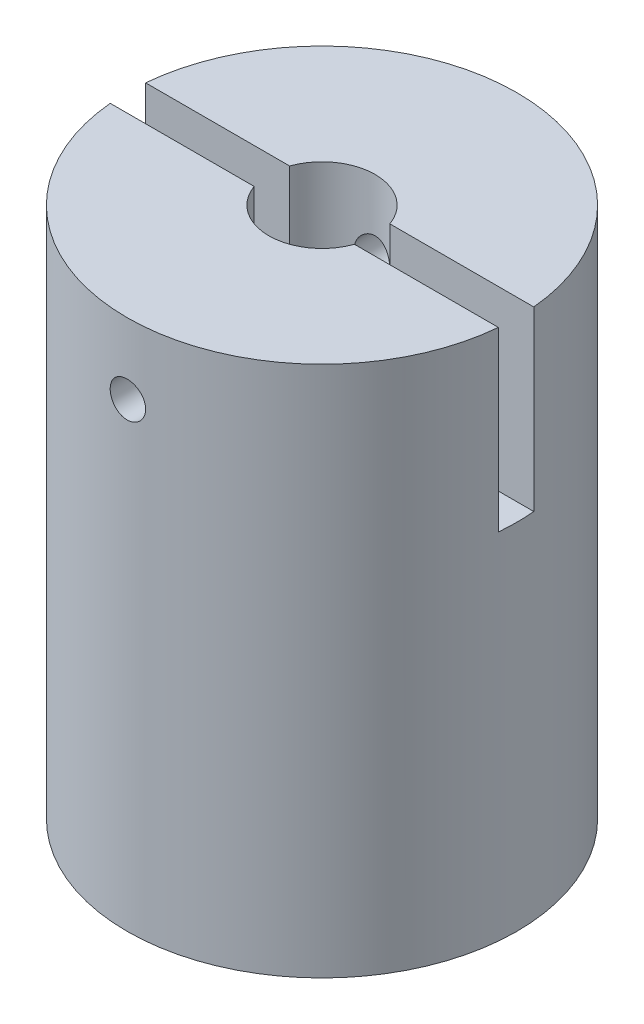
ISO-10303-21;
HEADER;
FILE_DESCRIPTION(('STEP AP214'),'2;1');
FILE_NAME('part.step','',(''),(''),'','','');
FILE_SCHEMA(('AUTOMOTIVE_DESIGN { 1 0 10303 214 1 1 1 1 }'));
ENDSEC;
DATA;
#1=APPLICATION_CONTEXT('core data for automotive mechanical design processes');
#2=APPLICATION_PROTOCOL_DEFINITION('international standard','automotive_design',2000,#1);
#3=PRODUCT_CONTEXT('',#1,'mechanical');
#4=PRODUCT('Part','Part','',(#3));
#5=PRODUCT_RELATED_PRODUCT_CATEGORY('part','',(#4));
#6=PRODUCT_DEFINITION_FORMATION('','',#4);
#7=PRODUCT_DEFINITION_CONTEXT('part definition',#1,'design');
#8=PRODUCT_DEFINITION('design','',#6,#7);
#9=PRODUCT_DEFINITION_SHAPE('','',#8);
#10=(LENGTH_UNIT() NAMED_UNIT(*) SI_UNIT(.MILLI.,.METRE.));
#11=(NAMED_UNIT(*) PLANE_ANGLE_UNIT() SI_UNIT($,.RADIAN.));
#12=(NAMED_UNIT(*) SI_UNIT($,.STERADIAN.) SOLID_ANGLE_UNIT());
#13=UNCERTAINTY_MEASURE_WITH_UNIT(LENGTH_MEASURE(1.E-05),#10,'distance_accuracy_value','');
#14=(GEOMETRIC_REPRESENTATION_CONTEXT(3) GLOBAL_UNCERTAINTY_ASSIGNED_CONTEXT((#13)) GLOBAL_UNIT_ASSIGNED_CONTEXT((#10,
#11,#12)) REPRESENTATION_CONTEXT('',''));
#15=CARTESIAN_POINT('',(0.,0.,0.));
#16=DIRECTION('',(0.,0.,1.));
#17=DIRECTION('',(1.,0.,0.));
#18=AXIS2_PLACEMENT_3D('',#15,#16,#17);
#19=CARTESIAN_POINT('',(0.,30.,0.));
#20=DIRECTION('',(0.,1.,0.));
#21=DIRECTION('',(0.,0.,1.));
#22=AXIS2_PLACEMENT_3D('',#19,#20,#21);
#23=PLANE('',#22);
#24=DIRECTION('',(1.,0.,0.));
#25=VECTOR('',#24,1.);
#26=CARTESIAN_POINT('',(-15.,30.,1.));
#27=LINE('',#26,#25);
#28=CARTESIAN_POINT('',(-10.9544511501033,30.,1.));
#29=VERTEX_POINT('',#28);
#30=CARTESIAN_POINT('',(-2.82842712474619,30.,1.));
#31=VERTEX_POINT('',#30);
#32=EDGE_CURVE('E190',#29,#31,#27,.T.);
#33=ORIENTED_EDGE('',*,*,#32,.F.);
#34=CARTESIAN_POINT('',(0.,30.,0.));
#35=DIRECTION('',(0.,1.,0.));
#36=DIRECTION('',(0.,0.,1.));
#37=AXIS2_PLACEMENT_3D('',#34,#35,#36);
#38=CIRCLE('',#37,11.);
#39=CARTESIAN_POINT('',(10.9544511501033,30.,1.));
#40=VERTEX_POINT('',#39);
#41=EDGE_CURVE('E130',#29,#40,#38,.T.);
#42=ORIENTED_EDGE('',*,*,#41,.T.);
#43=CARTESIAN_POINT('',(2.82842712474619,30.,1.));
#44=VERTEX_POINT('',#43);
#45=EDGE_CURVE('E123',#44,#40,#27,.T.);
#46=ORIENTED_EDGE('',*,*,#45,.F.);
#47=CARTESIAN_POINT('',(0.,30.,0.));
#48=DIRECTION('',(0.,1.,0.));
#49=DIRECTION('',(0.,0.,1.));
#50=AXIS2_PLACEMENT_3D('',#47,#48,#49);
#51=CIRCLE('',#50,3.);
#52=EDGE_CURVE('E139',#31,#44,#51,.T.);
#53=ORIENTED_EDGE('',*,*,#52,.F.);
#54=EDGE_LOOP('',(#33,#42,#46,#53));
#55=FACE_BOUND('',#54,.T.);
#56=ADVANCED_FACE('F33',(#55),#23,.T.);
#57=CARTESIAN_POINT('',(0.,30.,0.));
#58=DIRECTION('',(0.,-1.,0.));
#59=DIRECTION('',(0.,0.,-1.));
#60=AXIS2_PLACEMENT_3D('',#57,#58,#59);
#61=CYLINDRICAL_SURFACE('',#60,11.);
#62=CARTESIAN_POINT('',(0.,27.,-11.));
#63=CARTESIAN_POINT('',(-0.0560463184098415,26.9999975607395,-10.9999994084562));
#64=CARTESIAN_POINT('',(-0.112130316304954,26.9952723598371,-10.9995670959793));
#65=CARTESIAN_POINT('',(-0.222745225910004,26.9764929361657,-10.9978840834393));
#66=CARTESIAN_POINT('',(-0.277274327670013,26.9624282700333,-10.9966324672553));
#67=CARTESIAN_POINT('',(-0.38316148573152,26.9253811851023,-10.9934522196378));
#68=CARTESIAN_POINT('',(-0.434521368502916,26.9024039594512,-10.9915239825183));
#69=CARTESIAN_POINT('',(-0.53264359406505,26.8481936342475,-10.987206461568));
#70=CARTESIAN_POINT('',(-0.579406887560637,26.8169622468395,-10.9848172733792));
#71=CARTESIAN_POINT('',(-0.667160744591637,26.7470291725081,-10.9798377243701));
#72=CARTESIAN_POINT('',(-0.708135584180957,26.7083077899558,-10.9772468441588));
#73=CARTESIAN_POINT('',(-0.783014385273113,26.6245356999598,-10.97216024971));
#74=CARTESIAN_POINT('',(-0.816918029190443,26.5794847083891,-10.969664539751));
#75=CARTESIAN_POINT('',(-0.876746442765576,26.4842354923924,-10.9650454120851));
#76=CARTESIAN_POINT('',(-0.902657198623715,26.434028430975,-10.9629226510361));
#77=CARTESIAN_POINT('',(-0.945674826570865,26.3299537184544,-10.9592959576819));
#78=CARTESIAN_POINT('',(-0.962781880853174,26.2760861431319,-10.9577920125704));
#79=CARTESIAN_POINT('',(-0.987660408754402,26.1663784311656,-10.9555777617686));
#80=CARTESIAN_POINT('',(-0.995457725299576,26.1105442000168,-10.9548652594953));
#81=CARTESIAN_POINT('',(-1.00157529840897,25.9983553051384,-10.9543076849163));
#82=CARTESIAN_POINT('',(-0.999895763568729,25.9420006528911,-10.9544625935181));
#83=CARTESIAN_POINT('',(-0.987128641978276,25.8305481673027,-10.9556203369129));
#84=CARTESIAN_POINT('',(-0.976069197492799,25.7754470801653,-10.9566206352764));
#85=CARTESIAN_POINT('',(-0.944899944512179,25.6678864528484,-10.9593524793284));
#86=CARTESIAN_POINT('',(-0.924790032934467,25.6154269427634,-10.9610840333458));
#87=CARTESIAN_POINT('',(-0.876059375700658,25.5145492561386,-10.9650862067995));
#88=CARTESIAN_POINT('',(-0.847426064602012,25.466137182362,-10.9673576211101));
#89=CARTESIAN_POINT('',(-0.782470448071283,25.3747953657685,-10.9721828791056));
#90=CARTESIAN_POINT('',(-0.746147956926685,25.3318657554067,-10.9747367296113));
#91=CARTESIAN_POINT('',(-0.666687485899894,25.2525438898792,-10.9798503993895));
#92=CARTESIAN_POINT('',(-0.623525187461479,25.2161759905318,-10.9824102065674));
#93=CARTESIAN_POINT('',(-0.531694989702884,25.151198411766,-10.9872385467403));
#94=CARTESIAN_POINT('',(-0.483027085716749,25.1225887389226,-10.9895070794885));
#95=CARTESIAN_POINT('',(-0.381550897425877,25.0739410198222,-10.993497831358));
#96=CARTESIAN_POINT('',(-0.328742060406797,25.0539041201352,-10.9952199773945));
#97=CARTESIAN_POINT('',(-0.220490619126558,25.0229881180008,-10.9979231236776));
#98=CARTESIAN_POINT('',(-0.165048079965399,25.0121087893203,-10.9989041422334));
#99=CARTESIAN_POINT('',(-0.0533140741783646,24.9998474462421,-11.0000121495707));
#100=CARTESIAN_POINT('',(0.00297367354059859,24.9984318042214,-11.0001421622246));
#101=CARTESIAN_POINT('',(0.11498566380967,25.0050498275353,-10.9995415990194));
#102=CARTESIAN_POINT('',(0.170709912624775,25.0130833876966,-10.9988110327388));
#103=CARTESIAN_POINT('',(0.279916706707345,25.0383438888438,-10.9965733842767));
#104=CARTESIAN_POINT('',(0.333402902587972,25.0555551744497,-10.995067624572));
#105=CARTESIAN_POINT('',(0.436728566317894,25.0986665288401,-10.9914486415711));
#106=CARTESIAN_POINT('',(0.486567965967461,25.1245667600685,-10.9893354069179));
#107=CARTESIAN_POINT('',(0.581337885149357,25.1844048198551,-10.9847306057481));
#108=CARTESIAN_POINT('',(0.626254337365279,25.2183648467217,-10.9822380012953));
#109=CARTESIAN_POINT('',(0.709761176719667,25.2933265340298,-10.977157767899));
#110=CARTESIAN_POINT('',(0.748351432920321,25.3343283401843,-10.97457013699));
#111=CARTESIAN_POINT('',(0.818226404119352,25.4223559688353,-10.9695824762449));
#112=CARTESIAN_POINT('',(0.849489120333607,25.4693992910092,-10.9671830253566));
#113=CARTESIAN_POINT('',(0.90367057153178,25.5680878026768,-10.9628518833791));
#114=CARTESIAN_POINT('',(0.926589403284441,25.619732938792,-10.960920186865));
#115=CARTESIAN_POINT('',(0.963395308749024,25.7260822284619,-10.9577466928029));
#116=CARTESIAN_POINT('',(0.977295685719687,25.7807817463992,-10.9565038794691));
#117=CARTESIAN_POINT('',(0.995713351025713,25.891750177403,-10.9548455848288));
#118=CARTESIAN_POINT('',(1.00023085779494,25.9480190539037,-10.9544300842624));
#119=CARTESIAN_POINT('',(0.999751807856489,26.0603103058787,-10.9544737983698));
#120=CARTESIAN_POINT('',(0.994789811978365,26.1163328332573,-10.9549298355514));
#121=CARTESIAN_POINT('',(0.975564848079284,26.2267451660217,-10.9566584801842));
#122=CARTESIAN_POINT('',(0.96130186735501,26.2811349691774,-10.9579310887508));
#123=CARTESIAN_POINT('',(0.923888910367321,26.3867390695414,-10.9611486303441));
#124=CARTESIAN_POINT('',(0.900739731146511,26.4379536510709,-10.9630935030709));
#125=CARTESIAN_POINT('',(0.846215209238906,26.5357754879928,-10.9674365507443));
#126=CARTESIAN_POINT('',(0.8148399596167,26.5823827955007,-10.9698347205624));
#127=CARTESIAN_POINT('',(0.744623983723092,26.669844120195,-10.974824588714));
#128=CARTESIAN_POINT('',(0.70575757431845,26.7106774816792,-10.9774169335148));
#129=CARTESIAN_POINT('',(0.621711388303164,26.7852590655183,-10.9824971408049));
#130=CARTESIAN_POINT('',(0.57653009316168,26.8190055788107,-10.9849849779758));
#131=CARTESIAN_POINT('',(0.481033658224404,26.8785099385,-10.9895812046646));
#132=CARTESIAN_POINT('',(0.43070773122101,26.9042505219407,-10.991688770164));
#133=CARTESIAN_POINT('',(0.326462314296748,26.946882518673,-10.9952776769949));
#134=CARTESIAN_POINT('',(0.272547000575702,26.9637840200696,-10.9967597318513));
#135=CARTESIAN_POINT('',(0.181932564267666,26.9839924120221,-10.9985536427098));
#136=CARTESIAN_POINT('',(0.145814736978494,26.9899871829146,-10.9990935316791));
#137=CARTESIAN_POINT('',(0.0731366213756721,26.9979917663389,-10.9998169027657));
#138=CARTESIAN_POINT('',(0.0365763345072774,27.0000015918835,-11.0000003860468));
#139=CARTESIAN_POINT('',(0.,27.,-11.));
#140=B_SPLINE_CURVE_WITH_KNOTS('',3,(#62,#63,#64,#65,#66,#67,#68,#69,#70,#71,#72,#73,#74,#75,
#76,#77,#78,#79,#80,#81,#82,#83,#84,#85,#86,#87,#88,#89,#90,#91,#92,#93,#94,#95,#96,#97,#98,#99,
#100,#101,#102,#103,#104,#105,#106,#107,#108,#109,#110,#111,#112,#113,#114,#115,#116,#117,#118,
#119,#120,#121,#122,#123,#124,#125,#126,#127,#128,#129,#130,#131,#132,#133,#134,#135,#136,#137,
#138,#139),.UNSPECIFIED.,.T.,.F.,(4,2,2,2,2,2,2,2,2,2,2,2,2,2,2,2,2,2,2,2,2,2,2,2,2,2,2,2,2,2,2,
2,2,2,2,2,2,2,4),(0.,0.168005403293995,0.336198986814517,0.504294714589823,0.672355601927657,
0.840864580762712,1.00938112613858,1.17819147121128,1.34699832260011,1.5153354849808,
1.68366894209663,1.85149913268035,2.01933123485658,2.18741199578102,2.3554968167304,
2.52419324668971,2.69288981961892,2.86160894791216,3.0303239079642,3.19843904757525,
3.36655231601789,3.53437972962951,3.7022102810255,3.87050854855107,4.0388102990268,
4.20761103289357,4.37640980902048,4.54495901796128,4.71350430302095,4.88143627001254,
5.04936846636667,5.21728560365455,5.38520084131545,5.5537023527987,5.72224445351765,
5.89114749675569,6.05985734676957,6.16949955112994,6.27914139745025),.UNSPECIFIED.);
#141=CARTESIAN_POINT('',(0.,27.,-11.));
#142=VERTEX_POINT('',#141);
#143=EDGE_CURVE('E180',#142,#142,#140,.T.);
#144=ORIENTED_EDGE('',*,*,#143,.T.);
#145=EDGE_LOOP('',(#144));
#146=FACE_BOUND('',#145,.T.);
#147=CARTESIAN_POINT('',(1.,26.,10.9544511501033));
#148=CARTESIAN_POINT('',(0.999997560254834,25.9439542211787,10.9544517508113));
#149=CARTESIAN_POINT('',(0.995272447261057,25.8878707611436,10.9548858995989));
#150=CARTESIAN_POINT('',(0.97649340451669,25.7772569690813,10.9565754722183));
#151=CARTESIAN_POINT('',(0.962429029544901,25.7227284474263,10.9578318155864));
#152=CARTESIAN_POINT('',(0.925382796374861,25.6168425159251,10.9610223176075));
#153=CARTESIAN_POINT('',(0.902406145177949,25.5654832746966,10.962956080414));
#154=CARTESIAN_POINT('',(0.848197172713507,25.4673621237684,10.9672830433453));
#155=CARTESIAN_POINT('',(0.816966562177038,25.4205992641661,10.9696761482379));
#156=CARTESIAN_POINT('',(0.747034272072864,25.3328449159189,10.9746602823738));
#157=CARTESIAN_POINT('',(0.708312723364596,25.2918692889541,10.9772518266651));
#158=CARTESIAN_POINT('',(0.624539970629447,25.2169889685794,10.9823361407473));
#159=CARTESIAN_POINT('',(0.579488484622183,25.1830845903404,10.9848289061316));
#160=CARTESIAN_POINT('',(0.484238836673085,25.1232554098761,10.9894397775055));
#161=CARTESIAN_POINT('',(0.434031922755742,25.0973444863092,10.9915572291746));
#162=CARTESIAN_POINT('',(0.329957530859581,25.0543265075961,10.9951733171235));
#163=CARTESIAN_POINT('',(0.276090127830823,25.037219272252,10.9966719660691));
#164=CARTESIAN_POINT('',(0.166382938207478,25.0123403645351,10.9988779842707));
#165=CARTESIAN_POINT('',(0.110549060395158,25.004542833902,10.9995875448885));
#166=CARTESIAN_POINT('',(-0.00163914303909971,24.9984247102008,11.0001428768677));
#167=CARTESIAN_POINT('',(-0.0579934573054855,25.0001039108426,10.9999886670317));
#168=CARTESIAN_POINT('',(-0.169447419867294,25.0128705044771,10.9988356349174));
#169=CARTESIAN_POINT('',(-0.224550282636001,25.0239300915858,10.9978393089187));
#170=CARTESIAN_POINT('',(-0.332114387619648,25.055100245746,10.9951169372367));
#171=CARTESIAN_POINT('',(-0.384575600679962,25.0752109126655,10.9933908835017));
#172=CARTESIAN_POINT('',(-0.485455347169493,25.1239431314994,10.9893988885857));
#173=CARTESIAN_POINT('',(-0.533867863586916,25.1525770722258,10.9871321624821));
#174=CARTESIAN_POINT('',(-0.625210298204645,25.2175340312951,10.9823133884739));
#175=CARTESIAN_POINT('',(-0.668140083705701,25.2538572356857,10.9797613336663));
#176=CARTESIAN_POINT('',(-0.747461139246578,25.3333182111694,10.974647636397));
#177=CARTESIAN_POINT('',(-0.783828197606402,25.3764801555675,10.9720859926448));
#178=CARTESIAN_POINT('',(-0.848804248472285,25.4683093458604,10.9672510825487));
#179=CARTESIAN_POINT('',(-0.877413232674569,25.5169765976478,10.9649778165135));
#180=CARTESIAN_POINT('',(-0.926060456943912,25.6184526123647,10.9609767271737));
#181=CARTESIAN_POINT('',(-0.946097337230527,25.671262030789,10.9592489904169));
#182=CARTESIAN_POINT('',(-0.977013122262535,25.7795147353638,10.9565363289721));
#183=CARTESIAN_POINT('',(-0.98789225674986,25.8349579554029,10.9555513856496));
#184=CARTESIAN_POINT('',(-1.00015286782754,25.9466922729853,10.954438951586));
#185=CARTESIAN_POINT('',(-1.00156815482263,26.0029796313858,10.9543084084628));
#186=CARTESIAN_POINT('',(-0.994949560430577,26.1149907576165,10.9549115004788));
#187=CARTESIAN_POINT('',(-0.986915784217658,26.1707145317129,10.9556451259993));
#188=CARTESIAN_POINT('',(-0.961655343166036,26.2799189894829,10.9578911146059));
#189=CARTESIAN_POINT('',(-0.944444546844586,26.333403373756,10.9594021332984));
#190=CARTESIAN_POINT('',(-0.901334778059244,26.4367256308682,10.9630315520313));
#191=CARTESIAN_POINT('',(-0.875435640271391,26.4865634342973,10.9651499636291));
#192=CARTESIAN_POINT('',(-0.815599185736732,26.5813322732464,10.9697628742462));
#193=CARTESIAN_POINT('',(-0.781639392791685,26.6262490658229,10.9722584176542));
#194=CARTESIAN_POINT('',(-0.706677976316731,26.7097567009368,10.9773409274578));
#195=CARTESIAN_POINT('',(-0.665676208718393,26.7483474140204,10.9799278957231));
#196=CARTESIAN_POINT('',(-0.577648379080085,26.8182233620151,10.9849109146188));
#197=CARTESIAN_POINT('',(-0.530604810821167,26.8494865908745,10.9873063762702));
#198=CARTESIAN_POINT('',(-0.431915671283388,26.9036689417386,10.9916279546446));
#199=CARTESIAN_POINT('',(-0.380270153453551,26.9265881606385,10.9935540768178));
#200=CARTESIAN_POINT('',(-0.273921113239584,26.9633943244313,10.9967172675743));
#201=CARTESIAN_POINT('',(-0.219222284792737,26.9772947402985,10.9979553634324));
#202=CARTESIAN_POINT('',(-0.108255307091475,26.9957127170673,10.9996071930653));
#203=CARTESIAN_POINT('',(-0.0519871937858168,27.0002304927253,11.0000209457081));
#204=CARTESIAN_POINT('',(0.0603045280353013,26.9997522227809,10.9999774829522));
#205=CARTESIAN_POINT('',(0.116328286752866,26.9947904143708,10.9995234018861));
#206=CARTESIAN_POINT('',(0.226743128750862,26.975565392042,10.9978014810173));
#207=CARTESIAN_POINT('',(0.281134210184349,26.9613021676016,10.9965336402942));
#208=CARTESIAN_POINT('',(0.386740857088296,26.9238882457305,10.9933263613998));
#209=CARTESIAN_POINT('',(0.437956703518488,26.9007383359428,10.9913869827498));
#210=CARTESIAN_POINT('',(0.535780765065359,26.8462119616544,10.9870532563506));
#211=CARTESIAN_POINT('',(0.582389033080556,26.8148355916148,10.9846589138258));
#212=CARTESIAN_POINT('',(0.669850290308725,26.7446183882054,10.9796734621922));
#213=CARTESIAN_POINT('',(0.710682828578551,26.7057521276214,10.9770817015369));
#214=CARTESIAN_POINT('',(0.785262821067202,26.6217065772999,10.9719990677238));
#215=CARTESIAN_POINT('',(0.819008564073467,26.5765257671965,10.9695082190496));
#216=CARTESIAN_POINT('',(0.878512100284542,26.4810297226542,10.964903640195));
#217=CARTESIAN_POINT('',(0.904252490719367,26.4307036139045,10.9627907357997));
#218=CARTESIAN_POINT('',(0.946884076173027,26.3264578104975,10.9591912326929));
#219=CARTESIAN_POINT('',(0.963785361996738,26.2725422931933,10.9577039201814));
#220=CARTESIAN_POINT('',(0.983993142840088,26.1819284342987,10.9559033088399));
#221=CARTESIAN_POINT('',(0.989987638731625,26.1458114312275,10.9553612835581));
#222=CARTESIAN_POINT('',(0.99799185679994,26.0731349671128,10.9546350087714));
#223=CARTESIAN_POINT('',(1.0000015921791,26.0365755075356,10.9544507580809));
#224=CARTESIAN_POINT('',(1.,26.,10.9544511501033));
#225=B_SPLINE_CURVE_WITH_KNOTS('',3,(#147,#148,#149,#150,#151,#152,#153,#154,#155,#156,#157,
#158,#159,#160,#161,#162,#163,#164,#165,#166,#167,#168,#169,#170,#171,#172,#173,#174,#175,#176,
#177,#178,#179,#180,#181,#182,#183,#184,#185,#186,#187,#188,#189,#190,#191,#192,#193,#194,#195,
#196,#197,#198,#199,#200,#201,#202,#203,#204,#205,#206,#207,#208,#209,#210,#211,#212,#213,#214,
#215,#216,#217,#218,#219,#220,#221,#222,#223,#224),.UNSPECIFIED.,.T.,.F.,(4,2,2,2,2,2,2,2,2,2,2,
2,2,2,2,2,2,2,2,2,2,2,2,2,2,2,2,2,2,2,2,2,2,2,2,2,2,2,4),(0.,0.168003782557651,
0.336195781161783,0.504289661171324,0.672348729013333,0.840859828634801,1.00937843731933,
1.17818801124541,1.34699412976499,1.51533028026027,1.68366276641801,1.85149800858578,
2.01933510266518,2.18741735383105,2.35550367234286,2.52419796477562,2.69289243776787,
2.86161366060712,3.03033065058212,3.19844456114211,3.36655660050245,3.53437888582246,
3.70220436468859,3.87050341961896,4.03880591811036,4.20760756864075,4.37640725889159,
4.54495423675486,4.71349735675538,4.8814329040551,5.04936864132251,5.21728949757475,
5.38520842574342,5.55370779261807,5.72224779951832,5.89115167368363,6.05986230235814,
6.16950203086981,6.27914139612045),.UNSPECIFIED.);
#226=CARTESIAN_POINT('',(1.,26.,10.9544511501033));
#227=VERTEX_POINT('',#226);
#228=EDGE_CURVE('E175',#227,#227,#225,.T.);
#229=ORIENTED_EDGE('',*,*,#228,.T.);
#230=EDGE_LOOP('',(#229));
#231=FACE_BOUND('',#230,.T.);
#232=CARTESIAN_POINT('',(0.,20.,0.));
#233=DIRECTION('',(0.,1.,0.));
#234=DIRECTION('',(0.,0.,1.));
#235=AXIS2_PLACEMENT_3D('',#232,#233,#234);
#236=CIRCLE('',#235,11.);
#237=CARTESIAN_POINT('',(10.9544511501033,20.,1.));
#238=VERTEX_POINT('',#237);
#239=CARTESIAN_POINT('',(10.9544511501033,20.,-1.));
#240=VERTEX_POINT('',#239);
#241=EDGE_CURVE('E197',#238,#240,#236,.T.);
#242=ORIENTED_EDGE('',*,*,#241,.F.);
#243=DIRECTION('',(0.,-1.,0.));
#244=VECTOR('',#243,1.);
#245=CARTESIAN_POINT('',(10.9544511501033,30.,1.));
#246=LINE('',#245,#244);
#247=EDGE_CURVE('E112',#238,#40,#246,.F.);
#248=ORIENTED_EDGE('',*,*,#247,.T.);
#249=ORIENTED_EDGE('',*,*,#41,.F.);
#250=DIRECTION('',(0.,-1.,0.));
#251=VECTOR('',#250,1.);
#252=CARTESIAN_POINT('',(-10.9544511501033,30.,1.));
#253=LINE('',#252,#251);
#254=CARTESIAN_POINT('',(-10.9544511501033,20.,1.));
#255=VERTEX_POINT('',#254);
#256=EDGE_CURVE('E201',#29,#255,#253,.T.);
#257=ORIENTED_EDGE('',*,*,#256,.T.);
#258=CARTESIAN_POINT('',(-10.9544511501033,20.,-1.));
#259=VERTEX_POINT('',#258);
#260=EDGE_CURVE('E195',#259,#255,#236,.T.);
#261=ORIENTED_EDGE('',*,*,#260,.F.);
#262=DIRECTION('',(0.,-1.,0.));
#263=VECTOR('',#262,1.);
#264=CARTESIAN_POINT('',(-10.9544511501033,30.,-1.));
#265=LINE('',#264,#263);
#266=CARTESIAN_POINT('',(-10.9544511501033,30.,-1.));
#267=VERTEX_POINT('',#266);
#268=EDGE_CURVE('E113',#259,#267,#265,.F.);
#269=ORIENTED_EDGE('',*,*,#268,.T.);
#270=CARTESIAN_POINT('',(10.9544511501033,30.,-1.));
#271=VERTEX_POINT('',#270);
#272=EDGE_CURVE('E120',#271,#267,#38,.T.);
#273=ORIENTED_EDGE('',*,*,#272,.F.);
#274=DIRECTION('',(0.,-1.,0.));
#275=VECTOR('',#274,1.);
#276=CARTESIAN_POINT('',(10.9544511501033,30.,-1.));
#277=LINE('',#276,#275);
#278=EDGE_CURVE('E104',#271,#240,#277,.T.);
#279=ORIENTED_EDGE('',*,*,#278,.T.);
#280=EDGE_LOOP('',(#242,#248,#249,#257,#261,#269,#273,#279));
#281=FACE_BOUND('',#280,.T.);
#282=CARTESIAN_POINT('',(0.,0.,0.));
#283=DIRECTION('',(0.,1.,0.));
#284=DIRECTION('',(0.,0.,1.));
#285=AXIS2_PLACEMENT_3D('',#282,#283,#284);
#286=CIRCLE('',#285,11.);
#287=CARTESIAN_POINT('',(0.,0.,11.));
#288=VERTEX_POINT('',#287);
#289=EDGE_CURVE('E136',#288,#288,#286,.T.);
#290=ORIENTED_EDGE('',*,*,#289,.T.);
#291=EDGE_LOOP('',(#290));
#292=FACE_BOUND('',#291,.T.);
#293=ADVANCED_FACE('F35',(#146,#231,#281,#292),#61,.T.);
#294=DIRECTION('',(-1.,0.,0.));
#295=VECTOR('',#294,1.);
#296=CARTESIAN_POINT('',(-15.,30.,-1.));
#297=LINE('',#296,#295);
#298=CARTESIAN_POINT('',(2.82842712474619,30.,-1.));
#299=VERTEX_POINT('',#298);
#300=EDGE_CURVE('E107',#271,#299,#297,.T.);
#301=ORIENTED_EDGE('',*,*,#300,.F.);
#302=ORIENTED_EDGE('',*,*,#272,.T.);
#303=CARTESIAN_POINT('',(-2.82842712474619,30.,-1.));
#304=VERTEX_POINT('',#303);
#305=EDGE_CURVE('E124',#304,#267,#297,.T.);
#306=ORIENTED_EDGE('',*,*,#305,.F.);
#307=EDGE_CURVE('E122',#299,#304,#51,.T.);
#308=ORIENTED_EDGE('',*,*,#307,.F.);
#309=EDGE_LOOP('',(#301,#302,#306,#308));
#310=FACE_BOUND('',#309,.T.);
#311=ADVANCED_FACE('F118',(#310),#23,.T.);
#312=CARTESIAN_POINT('',(0.,0.,0.));
#313=DIRECTION('',(0.,1.,0.));
#314=DIRECTION('',(0.,0.,1.));
#315=AXIS2_PLACEMENT_3D('',#312,#313,#314);
#316=PLANE('',#315);
#317=CARTESIAN_POINT('',(0.,0.,-7.5));
#318=DIRECTION('',(0.,-1.,0.));
#319=DIRECTION('',(0.,0.,-1.));
#320=AXIS2_PLACEMENT_3D('',#317,#318,#319);
#321=CIRCLE('',#320,1.);
#322=CARTESIAN_POINT('',(0.,0.,-8.5));
#323=VERTEX_POINT('',#322);
#324=EDGE_CURVE('E243',#323,#323,#321,.T.);
#325=ORIENTED_EDGE('',*,*,#324,.F.);
#326=EDGE_LOOP('',(#325));
#327=FACE_BOUND('',#326,.T.);
#328=CARTESIAN_POINT('',(0.,0.,7.5));
#329=DIRECTION('',(0.,-1.,0.));
#330=DIRECTION('',(0.,0.,-1.));
#331=AXIS2_PLACEMENT_3D('',#328,#329,#330);
#332=CIRCLE('',#331,1.);
#333=CARTESIAN_POINT('',(0.,0.,6.5));
#334=VERTEX_POINT('',#333);
#335=EDGE_CURVE('E181',#334,#334,#332,.T.);
#336=ORIENTED_EDGE('',*,*,#335,.F.);
#337=EDGE_LOOP('',(#336));
#338=FACE_BOUND('',#337,.T.);
#339=CARTESIAN_POINT('',(0.,0.,0.));
#340=DIRECTION('',(0.,1.,0.));
#341=DIRECTION('',(0.,0.,1.));
#342=AXIS2_PLACEMENT_3D('',#339,#340,#341);
#343=CIRCLE('',#342,3.);
#344=CARTESIAN_POINT('',(0.,0.,3.));
#345=VERTEX_POINT('',#344);
#346=EDGE_CURVE('E142',#345,#345,#343,.T.);
#347=ORIENTED_EDGE('',*,*,#346,.T.);
#348=EDGE_LOOP('',(#347));
#349=FACE_BOUND('',#348,.T.);
#350=ORIENTED_EDGE('',*,*,#289,.F.);
#351=EDGE_LOOP('',(#350));
#352=FACE_BOUND('',#351,.T.);
#353=ADVANCED_FACE('F225',(#327,#338,#349,#352),#316,.F.);
#354=CARTESIAN_POINT('',(0.,0.,0.));
#355=DIRECTION('',(0.,1.,0.));
#356=DIRECTION('',(0.,0.,1.));
#357=AXIS2_PLACEMENT_3D('',#354,#355,#356);
#358=CYLINDRICAL_SURFACE('',#357,3.);
#359=CARTESIAN_POINT('',(0.,25.,3.));
#360=CARTESIAN_POINT('',(0.0545633628867235,24.9999997462684,3.00000015300943));
#361=CARTESIAN_POINT('',(0.10912519453855,25.0044802661272,2.99849769507545));
#362=CARTESIAN_POINT('',(0.216641760872973,25.0222291088172,2.99265210203281));
#363=CARTESIAN_POINT('',(0.269596328118818,25.0354983439489,2.98830867202153));
#364=CARTESIAN_POINT('',(0.372332789501776,25.0703192433841,2.97725307906443));
#365=CARTESIAN_POINT('',(0.422119825886034,25.0918570624593,2.97054487730853));
#366=CARTESIAN_POINT('',(0.517374936805325,25.1425411728383,2.95544445717342));
#367=CARTESIAN_POINT('',(0.562842156958706,25.1716889650026,2.94705190667778));
#368=CARTESIAN_POINT('',(0.649741675022267,25.2378258048588,2.92914094443005));
#369=CARTESIAN_POINT('',(0.69100370029831,25.2750312342605,2.91959556463785));
#370=CARTESIAN_POINT('',(0.766832692702085,25.3557671547066,2.90060314783122));
#371=CARTESIAN_POINT('',(0.801398185489463,25.3992990349285,2.89115613290549));
#372=CARTESIAN_POINT('',(0.86382494222786,25.4929851151965,2.87313332477274));
#373=CARTESIAN_POINT('',(0.891464858221033,25.5432937397321,2.86459039275688));
#374=CARTESIAN_POINT('',(0.937818873877722,25.6481760944585,2.84975305418601));
#375=CARTESIAN_POINT('',(0.956535697386765,25.7027485171627,2.84345796160746));
#376=CARTESIAN_POINT('',(0.983873461509163,25.8126732214967,2.83411303269377));
#377=CARTESIAN_POINT('',(0.992813448271769,25.8679372084891,2.83096095769611));
#378=CARTESIAN_POINT('',(1.00134112333448,25.9792637541559,2.82795656629508));
#379=CARTESIAN_POINT('',(1.00093170160472,26.0353260607092,2.8281032302273));
#380=CARTESIAN_POINT('',(0.99101990370342,26.143936630444,2.8315901500818));
#381=CARTESIAN_POINT('',(0.981933913166995,26.196528402919,2.83478415867533));
#382=CARTESIAN_POINT('',(0.955606162849418,26.2993934196068,2.84376657724551));
#383=CARTESIAN_POINT('',(0.938363426591872,26.3496663854351,2.84955529784108));
#384=CARTESIAN_POINT('',(0.895939058060211,26.4474127495915,2.86317911131249));
#385=CARTESIAN_POINT('',(0.870634048707262,26.4948280254695,2.87104565793117));
#386=CARTESIAN_POINT('',(0.812889106303137,26.5848709082797,2.88792558575726));
#387=CARTESIAN_POINT('',(0.780447112364003,26.6274971269334,2.89693929790464));
#388=CARTESIAN_POINT('',(0.707349332682235,26.7090915981608,2.91567329167741));
#389=CARTESIAN_POINT('',(0.666353150076309,26.7477526945091,2.92540589354843));
#390=CARTESIAN_POINT('',(0.578339569970062,26.8177312666634,2.94406938387037));
#391=CARTESIAN_POINT('',(0.531321595660813,26.8490480381645,2.95300019538067));
#392=CARTESIAN_POINT('',(0.431947613046268,26.9036963002351,2.96917107937794));
#393=CARTESIAN_POINT('',(0.379543276416338,26.9269454913407,2.97639350008039));
#394=CARTESIAN_POINT('',(0.271269083364509,26.9642031739557,2.98820567144435));
#395=CARTESIAN_POINT('',(0.215400438154954,26.9782148754234,2.99279633654879));
#396=CARTESIAN_POINT('',(0.104383829529304,26.9960556660224,2.99867627071441));
#397=CARTESIAN_POINT('',(0.0493095998648452,27.0002998091728,3.00010001833731));
#398=CARTESIAN_POINT('',(-0.0607750699602365,26.9996673264015,2.99988902694825));
#399=CARTESIAN_POINT('',(-0.115785519319647,26.9947922400201,2.99825480419352));
#400=CARTESIAN_POINT('',(-0.222519866304259,26.976388092264,2.99220024717114));
#401=CARTESIAN_POINT('',(-0.274292806834856,26.9631137939505,2.98786198711228));
#402=CARTESIAN_POINT('',(-0.374855958579561,26.9286065555333,2.97691846830034));
#403=CARTESIAN_POINT('',(-0.42364578850856,26.9073726005323,2.97031292046541));
#404=CARTESIAN_POINT('',(-0.518288296393323,26.8569295681591,2.95528931287427));
#405=CARTESIAN_POINT('',(-0.564029959217331,26.8275254067164,2.94682814756305));
#406=CARTESIAN_POINT('',(-0.650064830135405,26.7618058499869,2.92905253915743));
#407=CARTESIAN_POINT('',(-0.690356367794895,26.7254883439698,2.91973783591888));
#408=CARTESIAN_POINT('',(-0.766252507807015,26.6450212489917,2.90076847982472));
#409=CARTESIAN_POINT('',(-0.801560969248494,26.6005907730668,2.89111761095155));
#410=CARTESIAN_POINT('',(-0.864257522320856,26.5062284321955,2.87299973286981));
#411=CARTESIAN_POINT('',(-0.891645547920845,26.4562965213898,2.8645327335312));
#412=CARTESIAN_POINT('',(-0.937596930423361,26.3523269846934,2.84982391820308));
#413=CARTESIAN_POINT('',(-0.956178132197766,26.2982979207572,2.84357760900632));
#414=CARTESIAN_POINT('',(-0.983894666792162,26.1876213498759,2.83410832399133));
#415=CARTESIAN_POINT('',(-0.993034254961244,26.1309750345669,2.83088398622698));
#416=CARTESIAN_POINT('',(-1.00127628247038,26.0198029039868,2.82797858875071));
#417=CARTESIAN_POINT('',(-1.00087025731093,25.9653176597483,2.82812400344299));
#418=CARTESIAN_POINT('',(-0.991242293454878,25.8572349251003,2.8315126992356));
#419=CARTESIAN_POINT('',(-0.982020879458887,25.8036373820471,2.83475579595884));
#420=CARTESIAN_POINT('',(-0.95537181312698,25.6998643369873,2.84384524278943));
#421=CARTESIAN_POINT('',(-0.938103346014879,25.6496431749928,2.84964098015514));
#422=CARTESIAN_POINT('',(-0.895979365760382,25.5527725930645,2.86316398825434));
#423=CARTESIAN_POINT('',(-0.87112216855398,25.5061239688127,2.87089168765297));
#424=CARTESIAN_POINT('',(-0.81326069258325,25.4155163300763,2.8878282922406));
#425=CARTESIAN_POINT('',(-0.779948242764534,25.3717634981014,2.89708711641604));
#426=CARTESIAN_POINT('',(-0.706642883135699,25.290310186616,2.91583356283786));
#427=CARTESIAN_POINT('',(-0.666648084451496,25.252611424312,2.92532124912518));
#428=CARTESIAN_POINT('',(-0.579241556920675,25.1828555877108,2.94390030525393));
#429=CARTESIAN_POINT('',(-0.531601513499726,25.151075652249,2.95296181801216));
#430=CARTESIAN_POINT('',(-0.431357357406628,25.0960095711494,2.96925991172652));
#431=CARTESIAN_POINT('',(-0.378754518132348,25.072721254078,2.9764969590794));
#432=CARTESIAN_POINT('',(-0.272493647200973,25.0362783675113,2.98805515068532));
#433=CARTESIAN_POINT('',(-0.218987757676407,25.0227175337366,2.9924921242252));
#434=CARTESIAN_POINT('',(-0.110320416010247,25.0045797193229,2.99846407064225));
#435=CARTESIAN_POINT('',(-0.0551594255687462,25.0000002565035,2.99999984531906));
#436=CARTESIAN_POINT('',(0.,25.,3.));
#437=B_SPLINE_CURVE_WITH_KNOTS('',3,(#359,#360,#361,#362,#363,#364,#365,#366,#367,#368,#369,
#370,#371,#372,#373,#374,#375,#376,#377,#378,#379,#380,#381,#382,#383,#384,#385,#386,#387,#388,
#389,#390,#391,#392,#393,#394,#395,#396,#397,#398,#399,#400,#401,#402,#403,#404,#405,#406,#407,
#408,#409,#410,#411,#412,#413,#414,#415,#416,#417,#418,#419,#420,#421,#422,#423,#424,#425,#426,
#427,#428,#429,#430,#431,#432,#433,#434,#435,#436),.UNSPECIFIED.,.T.,.F.,(4,2,2,2,2,2,2,2,2,2,2,
2,2,2,2,2,2,2,2,2,2,2,2,2,2,2,2,2,2,2,2,2,2,2,2,2,2,2,4),(0.,0.163487106026011,
0.326991185267521,0.490222672870275,0.653486377799101,0.821846842827561,0.990244332875303,
1.16348384823471,1.33667044692833,1.5040192574184,1.67131633987485,1.8309682655128,
1.99063930855482,2.15288171155131,2.31517102558208,2.48593305811368,2.65671145966618,
2.82918405650358,3.00159668877208,3.1665358317517,3.33144713164177,3.49158157978214,
3.65173645284104,3.81610399843737,3.98052180821892,4.15241022880752,4.32430008234997,
4.49584013824416,4.66730284700846,4.82995666056619,4.99260079341186,5.15215587070228,
5.31174638165788,5.47830066681615,5.64490211113589,5.81799660824911,5.99104681142267,
6.15636558363624,6.3216386602795),.UNSPECIFIED.);
#438=CARTESIAN_POINT('',(0.,25.,3.));
#439=VERTEX_POINT('',#438);
#440=EDGE_CURVE('E38',#439,#439,#437,.T.);
#441=ORIENTED_EDGE('',*,*,#440,.T.);
#442=EDGE_LOOP('',(#441));
#443=FACE_BOUND('',#442,.T.);
#444=CARTESIAN_POINT('',(1.,26.,-2.82842712474619));
#445=CARTESIAN_POINT('',(1.0000002579478,25.9455318251893,-2.82842694532735));
#446=CARTESIAN_POINT('',(0.99553478369814,25.8910652002285,-2.83001769372806));
#447=CARTESIAN_POINT('',(0.977851131702565,25.7837455790494,-2.8361757417458));
#448=CARTESIAN_POINT('',(0.964631512170674,25.7308928501361,-2.8407435316722));
#449=CARTESIAN_POINT('',(0.929955485680263,25.6283731069872,-2.85228203663888));
#450=CARTESIAN_POINT('',(0.908515221402,25.5787000705531,-2.8592480396464));
#451=CARTESIAN_POINT('',(0.858061628442627,25.4836399514562,-2.87479122017008));
#452=CARTESIAN_POINT('',(0.829046628860523,25.4382538174475,-2.88336875305432));
#453=CARTESIAN_POINT('',(0.763051146442528,25.3512800376605,-2.90154489405589));
#454=CARTESIAN_POINT('',(0.725824341377825,25.309884571328,-2.91116894844139));
#455=CARTESIAN_POINT('',(0.644987667214489,25.2337931987757,-2.93013864801508));
#456=CARTESIAN_POINT('',(0.601376775052401,25.1990983684177,-2.93948424829099));
#457=CARTESIAN_POINT('',(0.507604507964984,25.1365211026703,-2.95713866921658));
#458=CARTESIAN_POINT('',(0.457301911224518,25.108840029382,-2.96541407701568));
#459=CARTESIAN_POINT('',(0.35243122298748,25.0624084148725,-2.97969586771021));
#460=CARTESIAN_POINT('',(0.297864285687213,25.0436554668231,-2.98570286203012));
#461=CARTESIAN_POINT('',(0.188028817433491,25.0162641453676,-2.99459075431897));
#462=CARTESIAN_POINT('',(0.132850754852966,25.007296553743,-2.99757314777558));
#463=CARTESIAN_POINT('',(0.0216978748240897,24.9986837066393,-3.00043608218249));
#464=CARTESIAN_POINT('',(-0.0342767335438941,24.9990360483476,-3.00031742262891));
#465=CARTESIAN_POINT('',(-0.143103515193819,25.008844254566,-2.99706039618736));
#466=CARTESIAN_POINT('',(-0.195992048591668,25.0179425284745,-2.99404064755135));
#467=CARTESIAN_POINT('',(-0.299443438822162,25.0443929809805,-2.98546967339714));
#468=CARTESIAN_POINT('',(-0.350006137779177,25.0617457189798,-2.97991827631115));
#469=CARTESIAN_POINT('',(-0.448152474842016,25.1044213173061,-2.96675670293292));
#470=CARTESIAN_POINT('',(-0.495688220969001,25.1298459385468,-2.9591204252427));
#471=CARTESIAN_POINT('',(-0.585924325527172,25.1878597054484,-2.94258393038665));
#472=CARTESIAN_POINT('',(-0.628623334384771,25.2204508433266,-2.93368336200518));
#473=CARTESIAN_POINT('',(-0.710100866551908,25.2936743934607,-2.9150619185089));
#474=CARTESIAN_POINT('',(-0.748600157067557,25.3346131578454,-2.90532215172667));
#475=CARTESIAN_POINT('',(-0.818277259595891,25.4224487257227,-2.88647335245111));
#476=CARTESIAN_POINT('',(-0.849453943273006,25.4693464457132,-2.8773644173145));
#477=CARTESIAN_POINT('',(-0.903987455042734,25.5686536256154,-2.86070525135531));
#478=CARTESIAN_POINT('',(-0.927226463651051,25.6211321313678,-2.85317909338821));
#479=CARTESIAN_POINT('',(-0.964443193299509,25.7295713942663,-2.84081650878299));
#480=CARTESIAN_POINT('',(-0.978424795755531,25.7855306812218,-2.83597895501223));
#481=CARTESIAN_POINT('',(-0.996161282090475,25.8966383554006,-2.8297963630207));
#482=CARTESIAN_POINT('',(-1.00034909550575,25.9517094247457,-2.82830360315139));
#483=CARTESIAN_POINT('',(-0.999605438911605,26.061776149117,-2.828566720628));
#484=CARTESIAN_POINT('',(-0.99467562522726,26.1167718160248,-2.83032200792768));
#485=CARTESIAN_POINT('',(-0.97622565155183,26.2231569657112,-2.83673618089379));
#486=CARTESIAN_POINT('',(-0.963006393980554,26.2746054301506,-2.84129325440593));
#487=CARTESIAN_POINT('',(-0.928713862560595,26.3745436062394,-2.8526855367127));
#488=CARTESIAN_POINT('',(-0.907639196363456,26.4230327915908,-2.85952114934907));
#489=CARTESIAN_POINT('',(-0.857474340738899,26.5173804208469,-2.87496877595718));
#490=CARTESIAN_POINT('',(-0.828151118358486,26.5631066426418,-2.8836302566561));
#491=CARTESIAN_POINT('',(-0.762585630557567,26.6491460523837,-2.90165768730984));
#492=CARTESIAN_POINT('',(-0.726341325498783,26.6894576386612,-2.911023844438));
#493=CARTESIAN_POINT('',(-0.645891705900322,26.7655279840906,-2.92995038637844));
#494=CARTESIAN_POINT('',(-0.601387270546651,26.8009743900189,-2.93949843577895));
#495=CARTESIAN_POINT('',(-0.506827291400257,26.863916142348,-2.9572685161311));
#496=CARTESIAN_POINT('',(-0.456771944864551,26.8914117711624,-2.96549059417695));
#497=CARTESIAN_POINT('',(-0.352779862432294,26.9374201048617,-2.97964405810603));
#498=CARTESIAN_POINT('',(-0.298871123321196,26.9559912771481,-2.98559030004531));
#499=CARTESIAN_POINT('',(-0.188458465846016,26.9837277420601,-2.99458610837774));
#500=CARTESIAN_POINT('',(-0.131955491953888,26.9928964298805,-2.99763672034018));
#501=CARTESIAN_POINT('',(-0.0208153358600391,27.0012620776056,-3.00041863236257));
#502=CARTESIAN_POINT('',(0.0337847239200206,27.0009074539324,-3.00029920089441));
#503=CARTESIAN_POINT('',(0.142111145000175,26.9913426918536,-2.99712196519396));
#504=CARTESIAN_POINT('',(0.195837576819057,26.9821332718472,-2.99406439933567));
#505=CARTESIAN_POINT('',(0.300042119432062,26.955417765424,-2.98540914954421));
#506=CARTESIAN_POINT('',(0.350558270912796,26.9380457846471,-2.9798525836118));
#507=CARTESIAN_POINT('',(0.44797835093979,26.8956224689029,-2.96677160704464));
#508=CARTESIAN_POINT('',(0.494881624142411,26.8705697448031,-2.95924684047901));
#509=CARTESIAN_POINT('',(0.58563401630881,26.8124304878979,-2.94265868828001));
#510=CARTESIAN_POINT('',(0.629306251557699,26.7790813146181,-2.93354872492381));
#511=CARTESIAN_POINT('',(0.71058102627234,26.7057426088441,-2.91492988791425));
#512=CARTESIAN_POINT('',(0.748181621624261,26.6657509577383,-2.90542088771397));
#513=CARTESIAN_POINT('',(0.817741808833465,26.578390644412,-2.88663279827365));
#514=CARTESIAN_POINT('',(0.849422965999217,26.5307944890192,-2.87737727995345));
#515=CARTESIAN_POINT('',(0.9043143432998,26.4306655731014,-2.86060193316303));
#516=CARTESIAN_POINT('',(0.92752677681456,26.3781341069858,-2.8530816513617));
#517=CARTESIAN_POINT('',(0.963843828206627,26.2720381759762,-2.84101334230535));
#518=CARTESIAN_POINT('',(0.977357909163268,26.2186277364343,-2.83634632944799));
#519=CARTESIAN_POINT('',(0.995434320161695,26.1101439494845,-2.83005383613939));
#520=CARTESIAN_POINT('',(0.999999739196502,26.0550711825643,-2.82842730615135));
#521=CARTESIAN_POINT('',(1.,26.,-2.82842712474619));
#522=B_SPLINE_CURVE_WITH_KNOTS('',3,(#444,#445,#446,#447,#448,#449,#450,#451,#452,#453,#454,
#455,#456,#457,#458,#459,#460,#461,#462,#463,#464,#465,#466,#467,#468,#469,#470,#471,#472,#473,
#474,#475,#476,#477,#478,#479,#480,#481,#482,#483,#484,#485,#486,#487,#488,#489,#490,#491,#492,
#493,#494,#495,#496,#497,#498,#499,#500,#501,#502,#503,#504,#505,#506,#507,#508,#509,#510,#511,
#512,#513,#514,#515,#516,#517,#518,#519,#520,#521),.UNSPECIFIED.,.T.,.F.,(4,2,2,2,2,2,2,2,2,2,2,
2,2,2,2,2,2,2,2,2,2,2,2,2,2,2,2,2,2,2,2,2,2,2,2,2,2,2,4),(0.,0.163200584775416,
0.326428054968882,0.489336627454543,0.652281166139159,0.8210133742294,0.989772651673598,
1.16293506139029,1.33605076382161,1.50314318760306,1.67019253297699,1.83069004820941,
1.99119844184609,2.15381654855707,2.31647991869394,2.48680174359289,2.65714979607478,
2.82992639837377,3.00263051349689,3.16754291357513,3.33242535830307,3.4916439576185,
3.65089079140019,3.81518857728788,3.97953485655201,4.15178808164166,4.32403518750606,
4.49513791183925,4.6661788299723,4.82918084670709,4.99216964002854,5.15256956033503,
5.31299850756316,5.47935519513707,5.64576504425705,5.81868902729218,5.9915677825994,
6.15663212153686,6.3216394717923),.UNSPECIFIED.);
#523=CARTESIAN_POINT('',(1.,26.,-2.82842712474619));
#524=VERTEX_POINT('',#523);
#525=EDGE_CURVE('E149',#524,#524,#522,.T.);
#526=ORIENTED_EDGE('',*,*,#525,.T.);
#527=EDGE_LOOP('',(#526));
#528=FACE_BOUND('',#527,.T.);
#529=CARTESIAN_POINT('',(0.,20.,0.));
#530=DIRECTION('',(0.,1.,0.));
#531=DIRECTION('',(0.,0.,1.));
#532=AXIS2_PLACEMENT_3D('',#529,#530,#531);
#533=CIRCLE('',#532,3.);
#534=CARTESIAN_POINT('',(-2.82842712474619,20.,1.));
#535=VERTEX_POINT('',#534);
#536=CARTESIAN_POINT('',(-2.82842712474619,20.,-1.));
#537=VERTEX_POINT('',#536);
#538=EDGE_CURVE('E134',#535,#537,#533,.F.);
#539=ORIENTED_EDGE('',*,*,#538,.F.);
#540=DIRECTION('',(0.,1.,0.));
#541=VECTOR('',#540,1.);
#542=CARTESIAN_POINT('',(-2.82842712474619,0.,1.));
#543=LINE('',#542,#541);
#544=EDGE_CURVE('E11',#535,#31,#543,.T.);
#545=ORIENTED_EDGE('',*,*,#544,.T.);
#546=ORIENTED_EDGE('',*,*,#52,.T.);
#547=DIRECTION('',(0.,1.,0.));
#548=VECTOR('',#547,1.);
#549=CARTESIAN_POINT('',(2.82842712474619,0.,1.));
#550=LINE('',#549,#548);
#551=CARTESIAN_POINT('',(2.82842712474619,20.,1.));
#552=VERTEX_POINT('',#551);
#553=EDGE_CURVE('E145',#44,#552,#550,.F.);
#554=ORIENTED_EDGE('',*,*,#553,.T.);
#555=CARTESIAN_POINT('',(2.82842712474619,20.,-1.));
#556=VERTEX_POINT('',#555);
#557=EDGE_CURVE('E129',#556,#552,#533,.F.);
#558=ORIENTED_EDGE('',*,*,#557,.F.);
#559=DIRECTION('',(0.,1.,0.));
#560=VECTOR('',#559,1.);
#561=CARTESIAN_POINT('',(2.82842712474619,0.,-1.));
#562=LINE('',#561,#560);
#563=EDGE_CURVE('E132',#556,#299,#562,.T.);
#564=ORIENTED_EDGE('',*,*,#563,.T.);
#565=ORIENTED_EDGE('',*,*,#307,.T.);
#566=DIRECTION('',(0.,1.,0.));
#567=VECTOR('',#566,1.);
#568=CARTESIAN_POINT('',(-2.82842712474619,0.,-1.));
#569=LINE('',#568,#567);
#570=EDGE_CURVE('E47',#304,#537,#569,.F.);
#571=ORIENTED_EDGE('',*,*,#570,.T.);
#572=EDGE_LOOP('',(#539,#545,#546,#554,#558,#564,#565,#571));
#573=FACE_BOUND('',#572,.T.);
#574=ORIENTED_EDGE('',*,*,#346,.F.);
#575=EDGE_LOOP('',(#574));
#576=FACE_BOUND('',#575,.T.);
#577=ADVANCED_FACE('F154',(#443,#528,#573,#576),#358,.F.);
#578=CARTESIAN_POINT('',(0.,20.,0.));
#579=DIRECTION('',(0.,1.,0.));
#580=DIRECTION('',(0.,0.,1.));
#581=AXIS2_PLACEMENT_3D('',#578,#579,#580);
#582=PLANE('',#581);
#583=ORIENTED_EDGE('',*,*,#241,.T.);
#584=DIRECTION('',(-1.,0.,0.));
#585=VECTOR('',#584,1.);
#586=CARTESIAN_POINT('',(-15.,20.,-1.));
#587=LINE('',#586,#585);
#588=EDGE_CURVE('E63',#240,#556,#587,.T.);
#589=ORIENTED_EDGE('',*,*,#588,.T.);
#590=ORIENTED_EDGE('',*,*,#557,.T.);
#591=DIRECTION('',(1.,0.,0.));
#592=VECTOR('',#591,1.);
#593=CARTESIAN_POINT('',(-15.,20.,1.));
#594=LINE('',#593,#592);
#595=EDGE_CURVE('E191',#552,#238,#594,.T.);
#596=ORIENTED_EDGE('',*,*,#595,.T.);
#597=EDGE_LOOP('',(#583,#589,#590,#596));
#598=FACE_BOUND('',#597,.T.);
#599=ADVANCED_FACE('F168',(#598),#582,.T.);
#600=CARTESIAN_POINT('',(-15.,20.,-1.));
#601=DIRECTION('',(0.,0.,-1.));
#602=DIRECTION('',(-1.,0.,0.));
#603=AXIS2_PLACEMENT_3D('',#600,#601,#602);
#604=PLANE('',#603);
#605=ORIENTED_EDGE('',*,*,#300,.T.);
#606=ORIENTED_EDGE('',*,*,#563,.F.);
#607=ORIENTED_EDGE('',*,*,#588,.F.);
#608=ORIENTED_EDGE('',*,*,#278,.F.);
#609=EDGE_LOOP('',(#605,#606,#607,#608));
#610=FACE_BOUND('',#609,.T.);
#611=ADVANCED_FACE('F106',(#610),#604,.F.);
#612=CARTESIAN_POINT('',(-15.,20.,1.));
#613=DIRECTION('',(0.,0.,1.));
#614=DIRECTION('',(1.,0.,0.));
#615=AXIS2_PLACEMENT_3D('',#612,#613,#614);
#616=PLANE('',#615);
#617=ORIENTED_EDGE('',*,*,#595,.F.);
#618=ORIENTED_EDGE('',*,*,#553,.F.);
#619=ORIENTED_EDGE('',*,*,#45,.T.);
#620=ORIENTED_EDGE('',*,*,#247,.F.);
#621=EDGE_LOOP('',(#617,#618,#619,#620));
#622=FACE_BOUND('',#621,.T.);
#623=ADVANCED_FACE('F218',(#622),#616,.F.);
#624=ORIENTED_EDGE('',*,*,#32,.T.);
#625=ORIENTED_EDGE('',*,*,#544,.F.);
#626=EDGE_CURVE('E55',#255,#535,#594,.T.);
#627=ORIENTED_EDGE('',*,*,#626,.F.);
#628=ORIENTED_EDGE('',*,*,#256,.F.);
#629=EDGE_LOOP('',(#624,#625,#627,#628));
#630=FACE_BOUND('',#629,.T.);
#631=ADVANCED_FACE('F305',(#630),#616,.F.);
#632=EDGE_CURVE('E187',#537,#259,#587,.T.);
#633=ORIENTED_EDGE('',*,*,#632,.F.);
#634=ORIENTED_EDGE('',*,*,#570,.F.);
#635=ORIENTED_EDGE('',*,*,#305,.T.);
#636=ORIENTED_EDGE('',*,*,#268,.F.);
#637=EDGE_LOOP('',(#633,#634,#635,#636));
#638=FACE_BOUND('',#637,.T.);
#639=ADVANCED_FACE('F224',(#638),#604,.F.);
#640=ORIENTED_EDGE('',*,*,#260,.T.);
#641=ORIENTED_EDGE('',*,*,#626,.T.);
#642=ORIENTED_EDGE('',*,*,#538,.T.);
#643=ORIENTED_EDGE('',*,*,#632,.T.);
#644=EDGE_LOOP('',(#640,#641,#642,#643));
#645=FACE_BOUND('',#644,.T.);
#646=ADVANCED_FACE('F164',(#645),#582,.T.);
#647=CARTESIAN_POINT('',(0.,26.,-11.));
#648=DIRECTION('',(0.,0.,1.));
#649=DIRECTION('',(1.,0.,0.));
#650=AXIS2_PLACEMENT_3D('',#647,#648,#649);
#651=CYLINDRICAL_SURFACE('',#650,1.);
#652=ORIENTED_EDGE('',*,*,#525,.F.);
#653=EDGE_LOOP('',(#652));
#654=FACE_BOUND('',#653,.T.);
#655=ORIENTED_EDGE('',*,*,#143,.F.);
#656=EDGE_LOOP('',(#655));
#657=FACE_BOUND('',#656,.T.);
#658=ADVANCED_FACE('F158',(#654,#657),#651,.F.);
#659=ORIENTED_EDGE('',*,*,#440,.F.);
#660=EDGE_LOOP('',(#659));
#661=FACE_BOUND('',#660,.T.);
#662=ORIENTED_EDGE('',*,*,#228,.F.);
#663=EDGE_LOOP('',(#662));
#664=FACE_BOUND('',#663,.T.);
#665=ADVANCED_FACE('F163',(#661,#664),#651,.F.);
#666=CARTESIAN_POINT('',(0.,10.,7.5));
#667=DIRECTION('',(0.,-1.,0.));
#668=DIRECTION('',(0.,0.,-1.));
#669=AXIS2_PLACEMENT_3D('',#666,#667,#668);
#670=CYLINDRICAL_SURFACE('',#669,1.);
#671=CARTESIAN_POINT('',(0.,10.,7.5));
#672=DIRECTION('',(0.,-1.,0.));
#673=DIRECTION('',(0.,0.,-1.));
#674=AXIS2_PLACEMENT_3D('',#671,#672,#673);
#675=CIRCLE('',#674,1.);
#676=CARTESIAN_POINT('',(0.,10.,6.5));
#677=VERTEX_POINT('',#676);
#678=EDGE_CURVE('E153',#677,#677,#675,.T.);
#679=ORIENTED_EDGE('',*,*,#678,.F.);
#680=EDGE_LOOP('',(#679));
#681=FACE_BOUND('',#680,.T.);
#682=ORIENTED_EDGE('',*,*,#335,.T.);
#683=EDGE_LOOP('',(#682));
#684=FACE_BOUND('',#683,.T.);
#685=ADVANCED_FACE('F166',(#681,#684),#670,.F.);
#686=CARTESIAN_POINT('',(0.,10.,7.5));
#687=DIRECTION('',(0.,-1.,0.));
#688=DIRECTION('',(0.,0.,-1.));
#689=AXIS2_PLACEMENT_3D('',#686,#687,#688);
#690=PLANE('',#689);
#691=ORIENTED_EDGE('',*,*,#678,.T.);
#692=EDGE_LOOP('',(#691));
#693=FACE_BOUND('',#692,.T.);
#694=ADVANCED_FACE('F260',(#693),#690,.T.);
#695=CARTESIAN_POINT('',(0.,10.,-7.5));
#696=DIRECTION('',(0.,-1.,0.));
#697=DIRECTION('',(0.,0.,-1.));
#698=AXIS2_PLACEMENT_3D('',#695,#696,#697);
#699=CYLINDRICAL_SURFACE('',#698,1.);
#700=CARTESIAN_POINT('',(0.,10.,-7.5));
#701=DIRECTION('',(0.,-1.,0.));
#702=DIRECTION('',(0.,0.,-1.));
#703=AXIS2_PLACEMENT_3D('',#700,#701,#702);
#704=CIRCLE('',#703,1.);
#705=CARTESIAN_POINT('',(0.,10.,-8.5));
#706=VERTEX_POINT('',#705);
#707=EDGE_CURVE('E249',#706,#706,#704,.T.);
#708=ORIENTED_EDGE('',*,*,#707,.F.);
#709=EDGE_LOOP('',(#708));
#710=FACE_BOUND('',#709,.T.);
#711=ORIENTED_EDGE('',*,*,#324,.T.);
#712=EDGE_LOOP('',(#711));
#713=FACE_BOUND('',#712,.T.);
#714=ADVANCED_FACE('F257',(#710,#713),#699,.F.);
#715=CARTESIAN_POINT('',(0.,10.,-7.5));
#716=DIRECTION('',(0.,-1.,0.));
#717=DIRECTION('',(0.,0.,-1.));
#718=AXIS2_PLACEMENT_3D('',#715,#716,#717);
#719=PLANE('',#718);
#720=ORIENTED_EDGE('',*,*,#707,.T.);
#721=EDGE_LOOP('',(#720));
#722=FACE_BOUND('',#721,.T.);
#723=ADVANCED_FACE('F259',(#722),#719,.T.);
#724=CLOSED_SHELL('',(#56,#293,#311,#353,#577,#599,#611,#623,#631,#639,#646,#658,#665,#685,#694,
#714,#723));
#725=MANIFOLD_SOLID_BREP('B2',#724);
#726=ADVANCED_BREP_SHAPE_REPRESENTATION('',(#18,#725),#14);
#727=SHAPE_DEFINITION_REPRESENTATION(#9,#726);
ENDSEC;
END-ISO-10303-21;
